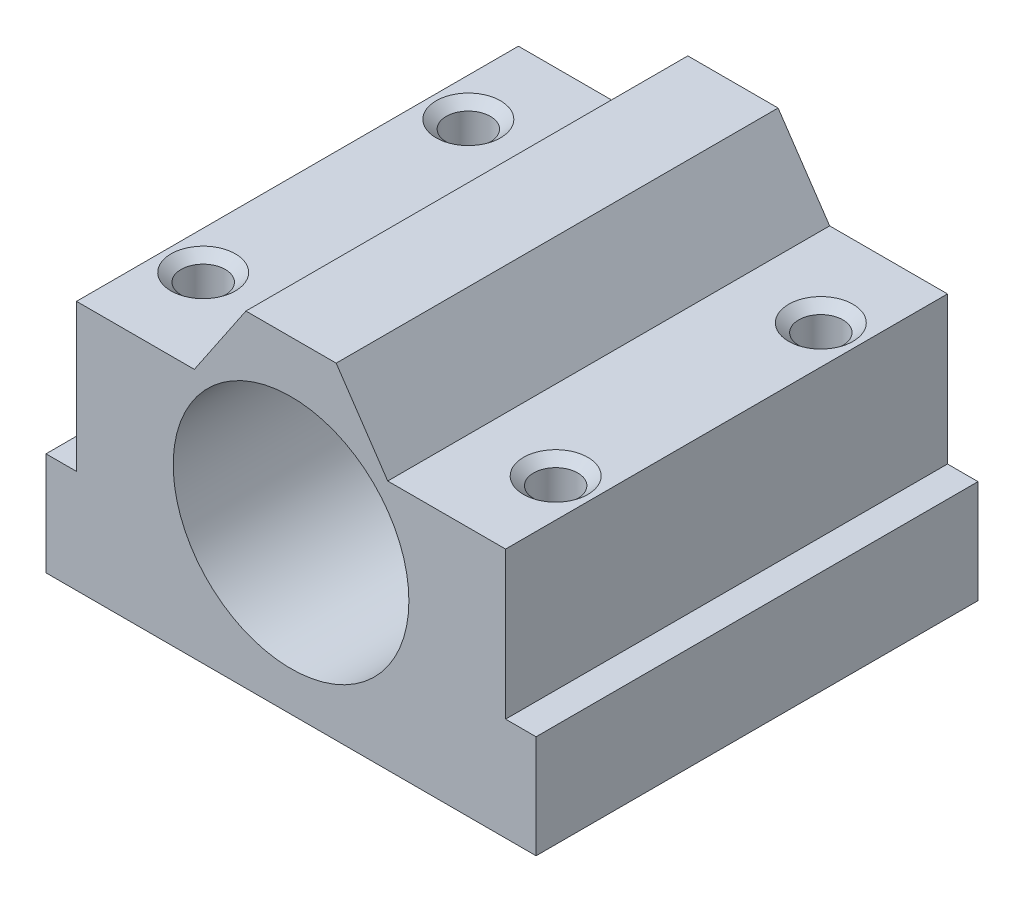
ISO-10303-21;
HEADER;
FILE_DESCRIPTION(('STEP AP214'),'2;1');
FILE_NAME('part.step','',(''),(''),'','','');
FILE_SCHEMA(('AUTOMOTIVE_DESIGN { 1 0 10303 214 1 1 1 1 }'));
ENDSEC;
DATA;
#1=APPLICATION_CONTEXT('core data for automotive mechanical design processes');
#2=APPLICATION_PROTOCOL_DEFINITION('international standard','automotive_design',2000,#1);
#3=PRODUCT_CONTEXT('',#1,'mechanical');
#4=PRODUCT('Part','Part','',(#3));
#5=PRODUCT_RELATED_PRODUCT_CATEGORY('part','',(#4));
#6=PRODUCT_DEFINITION_FORMATION('','',#4);
#7=PRODUCT_DEFINITION_CONTEXT('part definition',#1,'design');
#8=PRODUCT_DEFINITION('design','',#6,#7);
#9=PRODUCT_DEFINITION_SHAPE('','',#8);
#10=(LENGTH_UNIT() NAMED_UNIT(*) SI_UNIT(.MILLI.,.METRE.));
#11=(NAMED_UNIT(*) PLANE_ANGLE_UNIT() SI_UNIT($,.RADIAN.));
#12=(NAMED_UNIT(*) SI_UNIT($,.STERADIAN.) SOLID_ANGLE_UNIT());
#13=UNCERTAINTY_MEASURE_WITH_UNIT(LENGTH_MEASURE(1.E-05),#10,'distance_accuracy_value','');
#14=(GEOMETRIC_REPRESENTATION_CONTEXT(3) GLOBAL_UNCERTAINTY_ASSIGNED_CONTEXT((#13)) GLOBAL_UNIT_ASSIGNED_CONTEXT((#10,
#11,#12)) REPRESENTATION_CONTEXT('',''));
#15=CARTESIAN_POINT('',(0.,0.,0.));
#16=DIRECTION('',(0.,0.,1.));
#17=DIRECTION('',(1.,0.,0.));
#18=AXIS2_PLACEMENT_3D('',#15,#16,#17);
#19=CARTESIAN_POINT('',(0.,0.,30.));
#20=DIRECTION('',(0.,0.,1.));
#21=DIRECTION('',(1.,0.,0.));
#22=AXIS2_PLACEMENT_3D('',#19,#20,#21);
#23=PLANE('',#22);
#24=DIRECTION('',(1.,0.,0.));
#25=VECTOR('',#24,1.);
#26=CARTESIAN_POINT('',(0.,0.,30.));
#27=LINE('',#26,#25);
#28=CARTESIAN_POINT('',(0.,0.,30.));
#29=VERTEX_POINT('',#28);
#30=CARTESIAN_POINT('',(33.27,0.,30.));
#31=VERTEX_POINT('',#30);
#32=EDGE_CURVE('E187',#29,#31,#27,.T.);
#33=ORIENTED_EDGE('',*,*,#32,.T.);
#34=DIRECTION('',(0.,1.,0.));
#35=VECTOR('',#34,1.);
#36=CARTESIAN_POINT('',(33.27,0.,30.));
#37=LINE('',#36,#35);
#38=CARTESIAN_POINT('',(33.27,7.,30.));
#39=VERTEX_POINT('',#38);
#40=EDGE_CURVE('E115',#31,#39,#37,.T.);
#41=ORIENTED_EDGE('',*,*,#40,.T.);
#42=DIRECTION('',(-1.,0.,0.));
#43=VECTOR('',#42,1.);
#44=CARTESIAN_POINT('',(33.27,7.,30.));
#45=LINE('',#44,#43);
#46=CARTESIAN_POINT('',(31.1993641202158,7.,30.));
#47=VERTEX_POINT('',#46);
#48=EDGE_CURVE('E254',#39,#47,#45,.T.);
#49=ORIENTED_EDGE('',*,*,#48,.T.);
#50=DIRECTION('',(0.,1.,0.));
#51=VECTOR('',#50,1.);
#52=CARTESIAN_POINT('',(31.1993641202158,7.,30.));
#53=LINE('',#52,#51);
#54=CARTESIAN_POINT('',(31.1993641202158,17.,30.));
#55=VERTEX_POINT('',#54);
#56=EDGE_CURVE('E256',#47,#55,#53,.T.);
#57=ORIENTED_EDGE('',*,*,#56,.T.);
#58=DIRECTION('',(-1.,0.,0.));
#59=VECTOR('',#58,1.);
#60=CARTESIAN_POINT('',(31.1993641202158,17.,30.));
#61=LINE('',#60,#59);
#62=CARTESIAN_POINT('',(23.1993641202158,17.,30.));
#63=VERTEX_POINT('',#62);
#64=EDGE_CURVE('E258',#55,#63,#61,.T.);
#65=ORIENTED_EDGE('',*,*,#64,.T.);
#66=DIRECTION('',(-0.559857411277987,0.82858896869142,0.));
#67=VECTOR('',#66,1.);
#68=CARTESIAN_POINT('',(23.1993641202158,17.,30.));
#69=LINE('',#68,#67);
#70=CARTESIAN_POINT('',(19.6993641202158,22.18,30.));
#71=VERTEX_POINT('',#70);
#72=EDGE_CURVE('E260',#63,#71,#69,.T.);
#73=ORIENTED_EDGE('',*,*,#72,.T.);
#74=DIRECTION('',(-1.,0.,0.));
#75=VECTOR('',#74,1.);
#76=CARTESIAN_POINT('',(13.5706358797842,22.18,30.));
#77=LINE('',#76,#75);
#78=CARTESIAN_POINT('',(13.5706358797842,22.18,30.));
#79=VERTEX_POINT('',#78);
#80=EDGE_CURVE('E262',#71,#79,#77,.T.);
#81=ORIENTED_EDGE('',*,*,#80,.T.);
#82=DIRECTION('',(-0.559857411277987,-0.82858896869142,0.));
#83=VECTOR('',#82,1.);
#84=CARTESIAN_POINT('',(10.0706358797842,17.,30.));
#85=LINE('',#84,#83);
#86=CARTESIAN_POINT('',(10.0706358797842,17.,30.));
#87=VERTEX_POINT('',#86);
#88=EDGE_CURVE('E264',#79,#87,#85,.T.);
#89=ORIENTED_EDGE('',*,*,#88,.T.);
#90=DIRECTION('',(-1.,0.,0.));
#91=VECTOR('',#90,1.);
#92=CARTESIAN_POINT('',(2.0706358797842,17.,30.));
#93=LINE('',#92,#91);
#94=CARTESIAN_POINT('',(2.0706358797842,17.,30.));
#95=VERTEX_POINT('',#94);
#96=EDGE_CURVE('E146',#87,#95,#93,.T.);
#97=ORIENTED_EDGE('',*,*,#96,.T.);
#98=DIRECTION('',(0.,-1.,0.));
#99=VECTOR('',#98,1.);
#100=CARTESIAN_POINT('',(2.0706358797842,7.,30.));
#101=LINE('',#100,#99);
#102=CARTESIAN_POINT('',(2.0706358797842,7.,30.));
#103=VERTEX_POINT('',#102);
#104=EDGE_CURVE('E140',#95,#103,#101,.T.);
#105=ORIENTED_EDGE('',*,*,#104,.T.);
#106=DIRECTION('',(-1.,0.,0.));
#107=VECTOR('',#106,1.);
#108=CARTESIAN_POINT('',(0.,7.,30.));
#109=LINE('',#108,#107);
#110=CARTESIAN_POINT('',(0.,7.,30.));
#111=VERTEX_POINT('',#110);
#112=EDGE_CURVE('E144',#103,#111,#109,.T.);
#113=ORIENTED_EDGE('',*,*,#112,.T.);
#114=DIRECTION('',(0.,-1.,0.));
#115=VECTOR('',#114,1.);
#116=CARTESIAN_POINT('',(0.,0.,30.));
#117=LINE('',#116,#115);
#118=EDGE_CURVE('E60',#111,#29,#117,.T.);
#119=ORIENTED_EDGE('',*,*,#118,.T.);
#120=EDGE_LOOP('',(#33,#41,#49,#57,#65,#73,#81,#89,#97,#105,#113,#119));
#121=FACE_BOUND('',#120,.T.);
#122=CARTESIAN_POINT('',(16.635,10.68,30.));
#123=DIRECTION('',(0.,0.,1.));
#124=DIRECTION('',(1.,0.,0.));
#125=AXIS2_PLACEMENT_3D('',#122,#123,#124);
#126=CIRCLE('',#125,8.);
#127=CARTESIAN_POINT('',(24.635,10.68,30.));
#128=VERTEX_POINT('',#127);
#129=EDGE_CURVE('E168',#128,#128,#126,.T.);
#130=ORIENTED_EDGE('',*,*,#129,.F.);
#131=EDGE_LOOP('',(#130));
#132=FACE_BOUND('',#131,.T.);
#133=ADVANCED_FACE('F41',(#121,#132),#23,.T.);
#134=CARTESIAN_POINT('',(0.,0.,0.));
#135=DIRECTION('',(0.,0.,1.));
#136=DIRECTION('',(1.,0.,0.));
#137=AXIS2_PLACEMENT_3D('',#134,#135,#136);
#138=PLANE('',#137);
#139=DIRECTION('',(1.,0.,0.));
#140=VECTOR('',#139,1.);
#141=CARTESIAN_POINT('',(0.,0.,0.));
#142=LINE('',#141,#140);
#143=CARTESIAN_POINT('',(0.,0.,0.));
#144=VERTEX_POINT('',#143);
#145=CARTESIAN_POINT('',(33.27,0.,0.));
#146=VERTEX_POINT('',#145);
#147=EDGE_CURVE('E164',#144,#146,#142,.T.);
#148=ORIENTED_EDGE('',*,*,#147,.F.);
#149=DIRECTION('',(0.,-1.,0.));
#150=VECTOR('',#149,1.);
#151=CARTESIAN_POINT('',(0.,0.,0.));
#152=LINE('',#151,#150);
#153=CARTESIAN_POINT('',(0.,7.,0.));
#154=VERTEX_POINT('',#153);
#155=EDGE_CURVE('E107',#154,#144,#152,.T.);
#156=ORIENTED_EDGE('',*,*,#155,.F.);
#157=DIRECTION('',(-1.,0.,0.));
#158=VECTOR('',#157,1.);
#159=CARTESIAN_POINT('',(0.,7.,0.));
#160=LINE('',#159,#158);
#161=CARTESIAN_POINT('',(2.0706358797842,7.,0.));
#162=VERTEX_POINT('',#161);
#163=EDGE_CURVE('E101',#162,#154,#160,.T.);
#164=ORIENTED_EDGE('',*,*,#163,.F.);
#165=DIRECTION('',(0.,-1.,0.));
#166=VECTOR('',#165,1.);
#167=CARTESIAN_POINT('',(2.0706358797842,7.,0.));
#168=LINE('',#167,#166);
#169=CARTESIAN_POINT('',(2.0706358797842,17.,0.));
#170=VERTEX_POINT('',#169);
#171=EDGE_CURVE('E154',#170,#162,#168,.T.);
#172=ORIENTED_EDGE('',*,*,#171,.F.);
#173=DIRECTION('',(-1.,0.,0.));
#174=VECTOR('',#173,1.);
#175=CARTESIAN_POINT('',(2.0706358797842,17.,0.));
#176=LINE('',#175,#174);
#177=CARTESIAN_POINT('',(10.0706358797842,17.,0.));
#178=VERTEX_POINT('',#177);
#179=EDGE_CURVE('E182',#178,#170,#176,.T.);
#180=ORIENTED_EDGE('',*,*,#179,.F.);
#181=DIRECTION('',(-0.559857411277987,-0.82858896869142,0.));
#182=VECTOR('',#181,1.);
#183=CARTESIAN_POINT('',(10.0706358797842,17.,0.));
#184=LINE('',#183,#182);
#185=CARTESIAN_POINT('',(13.5706358797842,22.18,0.));
#186=VERTEX_POINT('',#185);
#187=EDGE_CURVE('E180',#186,#178,#184,.T.);
#188=ORIENTED_EDGE('',*,*,#187,.F.);
#189=DIRECTION('',(-1.,0.,0.));
#190=VECTOR('',#189,1.);
#191=CARTESIAN_POINT('',(13.5706358797842,22.18,0.));
#192=LINE('',#191,#190);
#193=CARTESIAN_POINT('',(19.6993641202158,22.18,0.));
#194=VERTEX_POINT('',#193);
#195=EDGE_CURVE('E178',#194,#186,#192,.T.);
#196=ORIENTED_EDGE('',*,*,#195,.F.);
#197=DIRECTION('',(-0.559857411277987,0.82858896869142,0.));
#198=VECTOR('',#197,1.);
#199=CARTESIAN_POINT('',(23.1993641202158,17.,0.));
#200=LINE('',#199,#198);
#201=CARTESIAN_POINT('',(23.1993641202158,17.,0.));
#202=VERTEX_POINT('',#201);
#203=EDGE_CURVE('E176',#202,#194,#200,.T.);
#204=ORIENTED_EDGE('',*,*,#203,.F.);
#205=DIRECTION('',(-1.,0.,0.));
#206=VECTOR('',#205,1.);
#207=CARTESIAN_POINT('',(31.1993641202158,17.,0.));
#208=LINE('',#207,#206);
#209=CARTESIAN_POINT('',(31.1993641202158,17.,0.));
#210=VERTEX_POINT('',#209);
#211=EDGE_CURVE('E174',#210,#202,#208,.T.);
#212=ORIENTED_EDGE('',*,*,#211,.F.);
#213=DIRECTION('',(0.,1.,0.));
#214=VECTOR('',#213,1.);
#215=CARTESIAN_POINT('',(31.1993641202158,7.,0.));
#216=LINE('',#215,#214);
#217=CARTESIAN_POINT('',(31.1993641202158,7.,0.));
#218=VERTEX_POINT('',#217);
#219=EDGE_CURVE('E172',#218,#210,#216,.T.);
#220=ORIENTED_EDGE('',*,*,#219,.F.);
#221=DIRECTION('',(-1.,0.,0.));
#222=VECTOR('',#221,1.);
#223=CARTESIAN_POINT('',(33.27,7.,0.));
#224=LINE('',#223,#222);
#225=CARTESIAN_POINT('',(33.27,7.,0.));
#226=VERTEX_POINT('',#225);
#227=EDGE_CURVE('E170',#226,#218,#224,.T.);
#228=ORIENTED_EDGE('',*,*,#227,.F.);
#229=DIRECTION('',(0.,1.,0.));
#230=VECTOR('',#229,1.);
#231=CARTESIAN_POINT('',(33.27,0.,0.));
#232=LINE('',#231,#230);
#233=EDGE_CURVE('E167',#146,#226,#232,.T.);
#234=ORIENTED_EDGE('',*,*,#233,.F.);
#235=EDGE_LOOP('',(#148,#156,#164,#172,#180,#188,#196,#204,#212,#220,#228,#234));
#236=FACE_BOUND('',#235,.T.);
#237=CARTESIAN_POINT('',(16.635,10.68,0.));
#238=DIRECTION('',(0.,0.,1.));
#239=DIRECTION('',(1.,0.,0.));
#240=AXIS2_PLACEMENT_3D('',#237,#238,#239);
#241=CIRCLE('',#240,8.);
#242=CARTESIAN_POINT('',(24.635,10.68,0.));
#243=VERTEX_POINT('',#242);
#244=EDGE_CURVE('E247',#243,#243,#241,.T.);
#245=ORIENTED_EDGE('',*,*,#244,.T.);
#246=EDGE_LOOP('',(#245));
#247=FACE_BOUND('',#246,.T.);
#248=ADVANCED_FACE('F277',(#236,#247),#138,.F.);
#249=CARTESIAN_POINT('',(0.,0.,30.));
#250=DIRECTION('',(0.,1.,0.));
#251=DIRECTION('',(0.,0.,1.));
#252=AXIS2_PLACEMENT_3D('',#249,#250,#251);
#253=PLANE('',#252);
#254=CARTESIAN_POINT('',(4.67063587978421,0.,6.));
#255=DIRECTION('',(0.,1.,0.));
#256=DIRECTION('',(0.,0.,1.));
#257=AXIS2_PLACEMENT_3D('',#254,#255,#256);
#258=CIRCLE('',#257,1.5);
#259=CARTESIAN_POINT('',(4.67063587978421,0.,7.5));
#260=VERTEX_POINT('',#259);
#261=EDGE_CURVE('E238',#260,#260,#258,.T.);
#262=ORIENTED_EDGE('',*,*,#261,.T.);
#263=EDGE_LOOP('',(#262));
#264=FACE_BOUND('',#263,.T.);
#265=CARTESIAN_POINT('',(4.67063587978422,0.,24.));
#266=DIRECTION('',(0.,1.,0.));
#267=DIRECTION('',(0.,0.,1.));
#268=AXIS2_PLACEMENT_3D('',#265,#266,#267);
#269=CIRCLE('',#268,1.5);
#270=CARTESIAN_POINT('',(4.67063587978422,0.,25.5));
#271=VERTEX_POINT('',#270);
#272=EDGE_CURVE('E214',#271,#271,#269,.T.);
#273=ORIENTED_EDGE('',*,*,#272,.T.);
#274=EDGE_LOOP('',(#273));
#275=FACE_BOUND('',#274,.T.);
#276=CARTESIAN_POINT('',(28.5993641202158,0.,24.));
#277=DIRECTION('',(0.,1.,0.));
#278=DIRECTION('',(0.,0.,1.));
#279=AXIS2_PLACEMENT_3D('',#276,#277,#278);
#280=CIRCLE('',#279,1.5);
#281=CARTESIAN_POINT('',(28.5993641202158,0.,25.5));
#282=VERTEX_POINT('',#281);
#283=EDGE_CURVE('E244',#282,#282,#280,.T.);
#284=ORIENTED_EDGE('',*,*,#283,.T.);
#285=EDGE_LOOP('',(#284));
#286=FACE_BOUND('',#285,.T.);
#287=CARTESIAN_POINT('',(28.5993641202158,0.,6.));
#288=DIRECTION('',(0.,1.,0.));
#289=DIRECTION('',(0.,0.,1.));
#290=AXIS2_PLACEMENT_3D('',#287,#288,#289);
#291=CIRCLE('',#290,1.5);
#292=CARTESIAN_POINT('',(28.5993641202158,0.,7.5));
#293=VERTEX_POINT('',#292);
#294=EDGE_CURVE('E241',#293,#293,#291,.T.);
#295=ORIENTED_EDGE('',*,*,#294,.T.);
#296=EDGE_LOOP('',(#295));
#297=FACE_BOUND('',#296,.T.);
#298=ORIENTED_EDGE('',*,*,#147,.T.);
#299=DIRECTION('',(0.,0.,-1.));
#300=VECTOR('',#299,1.);
#301=CARTESIAN_POINT('',(33.27,0.,30.));
#302=LINE('',#301,#300);
#303=EDGE_CURVE('E11',#31,#146,#302,.T.);
#304=ORIENTED_EDGE('',*,*,#303,.F.);
#305=ORIENTED_EDGE('',*,*,#32,.F.);
#306=DIRECTION('',(0.,0.,-1.));
#307=VECTOR('',#306,1.);
#308=CARTESIAN_POINT('',(0.,0.,30.));
#309=LINE('',#308,#307);
#310=EDGE_CURVE('E160',#29,#144,#309,.T.);
#311=ORIENTED_EDGE('',*,*,#310,.T.);
#312=EDGE_LOOP('',(#298,#304,#305,#311));
#313=FACE_BOUND('',#312,.T.);
#314=ADVANCED_FACE('F43',(#264,#275,#286,#297,#313),#253,.F.);
#315=CARTESIAN_POINT('',(33.27,0.,30.));
#316=DIRECTION('',(-1.,0.,0.));
#317=DIRECTION('',(0.,0.,1.));
#318=AXIS2_PLACEMENT_3D('',#315,#316,#317);
#319=PLANE('',#318);
#320=ORIENTED_EDGE('',*,*,#233,.T.);
#321=DIRECTION('',(0.,0.,-1.));
#322=VECTOR('',#321,1.);
#323=CARTESIAN_POINT('',(33.27,7.,30.));
#324=LINE('',#323,#322);
#325=EDGE_CURVE('E51',#39,#226,#324,.T.);
#326=ORIENTED_EDGE('',*,*,#325,.F.);
#327=ORIENTED_EDGE('',*,*,#40,.F.);
#328=ORIENTED_EDGE('',*,*,#303,.T.);
#329=EDGE_LOOP('',(#320,#326,#327,#328));
#330=FACE_BOUND('',#329,.T.);
#331=ADVANCED_FACE('F341',(#330),#319,.F.);
#332=CARTESIAN_POINT('',(33.27,7.,30.));
#333=DIRECTION('',(0.,-1.,0.));
#334=DIRECTION('',(0.,0.,-1.));
#335=AXIS2_PLACEMENT_3D('',#332,#333,#334);
#336=PLANE('',#335);
#337=ORIENTED_EDGE('',*,*,#227,.T.);
#338=DIRECTION('',(0.,0.,-1.));
#339=VECTOR('',#338,1.);
#340=CARTESIAN_POINT('',(31.1993641202158,7.,30.));
#341=LINE('',#340,#339);
#342=EDGE_CURVE('E206',#47,#218,#341,.T.);
#343=ORIENTED_EDGE('',*,*,#342,.F.);
#344=ORIENTED_EDGE('',*,*,#48,.F.);
#345=ORIENTED_EDGE('',*,*,#325,.T.);
#346=EDGE_LOOP('',(#337,#343,#344,#345));
#347=FACE_BOUND('',#346,.T.);
#348=ADVANCED_FACE('F348',(#347),#336,.F.);
#349=CARTESIAN_POINT('',(31.1993641202158,7.,30.));
#350=DIRECTION('',(-1.,0.,0.));
#351=DIRECTION('',(0.,0.,1.));
#352=AXIS2_PLACEMENT_3D('',#349,#350,#351);
#353=PLANE('',#352);
#354=ORIENTED_EDGE('',*,*,#219,.T.);
#355=DIRECTION('',(0.,0.,-1.));
#356=VECTOR('',#355,1.);
#357=CARTESIAN_POINT('',(31.1993641202158,17.,30.));
#358=LINE('',#357,#356);
#359=EDGE_CURVE('E203',#55,#210,#358,.T.);
#360=ORIENTED_EDGE('',*,*,#359,.F.);
#361=ORIENTED_EDGE('',*,*,#56,.F.);
#362=ORIENTED_EDGE('',*,*,#342,.T.);
#363=EDGE_LOOP('',(#354,#360,#361,#362));
#364=FACE_BOUND('',#363,.T.);
#365=ADVANCED_FACE('F357',(#364),#353,.F.);
#366=CARTESIAN_POINT('',(31.1993641202158,17.,30.));
#367=DIRECTION('',(0.,-1.,0.));
#368=DIRECTION('',(0.,0.,-1.));
#369=AXIS2_PLACEMENT_3D('',#366,#367,#368);
#370=PLANE('',#369);
#371=CARTESIAN_POINT('',(28.5993641202158,17.,24.));
#372=DIRECTION('',(0.,1.,0.));
#373=DIRECTION('',(0.,0.,1.));
#374=AXIS2_PLACEMENT_3D('',#371,#372,#373);
#375=CIRCLE('',#374,2.1844);
#376=CARTESIAN_POINT('',(28.5993641202158,17.,26.1844));
#377=VERTEX_POINT('',#376);
#378=EDGE_CURVE('E231',#377,#377,#375,.T.);
#379=ORIENTED_EDGE('',*,*,#378,.F.);
#380=EDGE_LOOP('',(#379));
#381=FACE_BOUND('',#380,.T.);
#382=CARTESIAN_POINT('',(28.5993641202158,17.,6.));
#383=DIRECTION('',(0.,1.,0.));
#384=DIRECTION('',(0.,0.,1.));
#385=AXIS2_PLACEMENT_3D('',#382,#383,#384);
#386=CIRCLE('',#385,2.1844);
#387=CARTESIAN_POINT('',(28.5993641202158,17.,8.1844));
#388=VERTEX_POINT('',#387);
#389=EDGE_CURVE('E221',#388,#388,#386,.T.);
#390=ORIENTED_EDGE('',*,*,#389,.F.);
#391=EDGE_LOOP('',(#390));
#392=FACE_BOUND('',#391,.T.);
#393=ORIENTED_EDGE('',*,*,#211,.T.);
#394=DIRECTION('',(0.,0.,-1.));
#395=VECTOR('',#394,1.);
#396=CARTESIAN_POINT('',(23.1993641202158,17.,30.));
#397=LINE('',#396,#395);
#398=EDGE_CURVE('E200',#63,#202,#397,.T.);
#399=ORIENTED_EDGE('',*,*,#398,.F.);
#400=ORIENTED_EDGE('',*,*,#64,.F.);
#401=ORIENTED_EDGE('',*,*,#359,.T.);
#402=EDGE_LOOP('',(#393,#399,#400,#401));
#403=FACE_BOUND('',#402,.T.);
#404=ADVANCED_FACE('F363',(#381,#392,#403),#370,.F.);
#405=CARTESIAN_POINT('',(23.1993641202158,17.,30.));
#406=DIRECTION('',(-0.82858896869142,-0.559857411277987,0.));
#407=DIRECTION('',(0.559857411277987,-0.82858896869142,0.));
#408=AXIS2_PLACEMENT_3D('',#405,#406,#407);
#409=PLANE('',#408);
#410=ORIENTED_EDGE('',*,*,#203,.T.);
#411=DIRECTION('',(0.,0.,-1.));
#412=VECTOR('',#411,1.);
#413=CARTESIAN_POINT('',(19.6993641202158,22.18,30.));
#414=LINE('',#413,#412);
#415=EDGE_CURVE('E197',#71,#194,#414,.T.);
#416=ORIENTED_EDGE('',*,*,#415,.F.);
#417=ORIENTED_EDGE('',*,*,#72,.F.);
#418=ORIENTED_EDGE('',*,*,#398,.T.);
#419=EDGE_LOOP('',(#410,#416,#417,#418));
#420=FACE_BOUND('',#419,.T.);
#421=ADVANCED_FACE('F367',(#420),#409,.F.);
#422=CARTESIAN_POINT('',(13.5706358797842,22.18,30.));
#423=DIRECTION('',(0.,-1.,0.));
#424=DIRECTION('',(0.,0.,-1.));
#425=AXIS2_PLACEMENT_3D('',#422,#423,#424);
#426=PLANE('',#425);
#427=ORIENTED_EDGE('',*,*,#195,.T.);
#428=DIRECTION('',(0.,0.,-1.));
#429=VECTOR('',#428,1.);
#430=CARTESIAN_POINT('',(13.5706358797842,22.18,30.));
#431=LINE('',#430,#429);
#432=EDGE_CURVE('E194',#79,#186,#431,.T.);
#433=ORIENTED_EDGE('',*,*,#432,.F.);
#434=ORIENTED_EDGE('',*,*,#80,.F.);
#435=ORIENTED_EDGE('',*,*,#415,.T.);
#436=EDGE_LOOP('',(#427,#433,#434,#435));
#437=FACE_BOUND('',#436,.T.);
#438=ADVANCED_FACE('F371',(#437),#426,.F.);
#439=CARTESIAN_POINT('',(10.0706358797842,17.,30.));
#440=DIRECTION('',(0.82858896869142,-0.559857411277987,0.));
#441=DIRECTION('',(0.559857411277987,0.82858896869142,0.));
#442=AXIS2_PLACEMENT_3D('',#439,#440,#441);
#443=PLANE('',#442);
#444=ORIENTED_EDGE('',*,*,#187,.T.);
#445=DIRECTION('',(0.,0.,-1.));
#446=VECTOR('',#445,1.);
#447=CARTESIAN_POINT('',(10.0706358797842,17.,30.));
#448=LINE('',#447,#446);
#449=EDGE_CURVE('E191',#87,#178,#448,.T.);
#450=ORIENTED_EDGE('',*,*,#449,.F.);
#451=ORIENTED_EDGE('',*,*,#88,.F.);
#452=ORIENTED_EDGE('',*,*,#432,.T.);
#453=EDGE_LOOP('',(#444,#450,#451,#452));
#454=FACE_BOUND('',#453,.T.);
#455=ADVANCED_FACE('F270',(#454),#443,.F.);
#456=CARTESIAN_POINT('',(2.0706358797842,17.,30.));
#457=DIRECTION('',(0.,-1.,0.));
#458=DIRECTION('',(0.,0.,-1.));
#459=AXIS2_PLACEMENT_3D('',#456,#457,#458);
#460=PLANE('',#459);
#461=CARTESIAN_POINT('',(4.67063587978422,17.,24.));
#462=DIRECTION('',(0.,1.,0.));
#463=DIRECTION('',(0.,0.,1.));
#464=AXIS2_PLACEMENT_3D('',#461,#462,#463);
#465=CIRCLE('',#464,2.1844);
#466=CARTESIAN_POINT('',(4.67063587978422,17.,26.1844));
#467=VERTEX_POINT('',#466);
#468=EDGE_CURVE('E218',#467,#467,#465,.T.);
#469=ORIENTED_EDGE('',*,*,#468,.F.);
#470=EDGE_LOOP('',(#469));
#471=FACE_BOUND('',#470,.T.);
#472=CARTESIAN_POINT('',(4.67063587978421,17.,6.));
#473=DIRECTION('',(0.,1.,0.));
#474=DIRECTION('',(0.,0.,1.));
#475=AXIS2_PLACEMENT_3D('',#472,#473,#474);
#476=CIRCLE('',#475,2.1844);
#477=CARTESIAN_POINT('',(4.67063587978421,17.,8.1844));
#478=VERTEX_POINT('',#477);
#479=EDGE_CURVE('E215',#478,#478,#476,.T.);
#480=ORIENTED_EDGE('',*,*,#479,.F.);
#481=EDGE_LOOP('',(#480));
#482=FACE_BOUND('',#481,.T.);
#483=ORIENTED_EDGE('',*,*,#179,.T.);
#484=DIRECTION('',(0.,0.,-1.));
#485=VECTOR('',#484,1.);
#486=CARTESIAN_POINT('',(2.0706358797842,17.,30.));
#487=LINE('',#486,#485);
#488=EDGE_CURVE('E155',#95,#170,#487,.T.);
#489=ORIENTED_EDGE('',*,*,#488,.F.);
#490=ORIENTED_EDGE('',*,*,#96,.F.);
#491=ORIENTED_EDGE('',*,*,#449,.T.);
#492=EDGE_LOOP('',(#483,#489,#490,#491));
#493=FACE_BOUND('',#492,.T.);
#494=ADVANCED_FACE('F274',(#471,#482,#493),#460,.F.);
#495=CARTESIAN_POINT('',(2.0706358797842,7.,30.));
#496=DIRECTION('',(1.,0.,0.));
#497=DIRECTION('',(0.,0.,-1.));
#498=AXIS2_PLACEMENT_3D('',#495,#496,#497);
#499=PLANE('',#498);
#500=ORIENTED_EDGE('',*,*,#171,.T.);
#501=DIRECTION('',(0.,0.,-1.));
#502=VECTOR('',#501,1.);
#503=CARTESIAN_POINT('',(2.0706358797842,7.,30.));
#504=LINE('',#503,#502);
#505=EDGE_CURVE('E151',#103,#162,#504,.T.);
#506=ORIENTED_EDGE('',*,*,#505,.F.);
#507=ORIENTED_EDGE('',*,*,#104,.F.);
#508=ORIENTED_EDGE('',*,*,#488,.T.);
#509=EDGE_LOOP('',(#500,#506,#507,#508));
#510=FACE_BOUND('',#509,.T.);
#511=ADVANCED_FACE('F152',(#510),#499,.F.);
#512=CARTESIAN_POINT('',(0.,7.,30.));
#513=DIRECTION('',(0.,-1.,0.));
#514=DIRECTION('',(0.,0.,-1.));
#515=AXIS2_PLACEMENT_3D('',#512,#513,#514);
#516=PLANE('',#515);
#517=ORIENTED_EDGE('',*,*,#163,.T.);
#518=DIRECTION('',(0.,0.,-1.));
#519=VECTOR('',#518,1.);
#520=CARTESIAN_POINT('',(0.,7.,30.));
#521=LINE('',#520,#519);
#522=EDGE_CURVE('E156',#111,#154,#521,.T.);
#523=ORIENTED_EDGE('',*,*,#522,.F.);
#524=ORIENTED_EDGE('',*,*,#112,.F.);
#525=ORIENTED_EDGE('',*,*,#505,.T.);
#526=EDGE_LOOP('',(#517,#523,#524,#525));
#527=FACE_BOUND('',#526,.T.);
#528=ADVANCED_FACE('F158',(#527),#516,.F.);
#529=CARTESIAN_POINT('',(0.,0.,30.));
#530=DIRECTION('',(1.,0.,0.));
#531=DIRECTION('',(0.,0.,-1.));
#532=AXIS2_PLACEMENT_3D('',#529,#530,#531);
#533=PLANE('',#532);
#534=ORIENTED_EDGE('',*,*,#155,.T.);
#535=ORIENTED_EDGE('',*,*,#310,.F.);
#536=ORIENTED_EDGE('',*,*,#118,.F.);
#537=ORIENTED_EDGE('',*,*,#522,.T.);
#538=EDGE_LOOP('',(#534,#535,#536,#537));
#539=FACE_BOUND('',#538,.T.);
#540=ADVANCED_FACE('F283',(#539),#533,.F.);
#541=CARTESIAN_POINT('',(16.635,10.68,30.));
#542=DIRECTION('',(0.,0.,-1.));
#543=DIRECTION('',(-1.,0.,0.));
#544=AXIS2_PLACEMENT_3D('',#541,#542,#543);
#545=CYLINDRICAL_SURFACE('',#544,8.);
#546=ORIENTED_EDGE('',*,*,#129,.T.);
#547=EDGE_LOOP('',(#546));
#548=FACE_BOUND('',#547,.T.);
#549=ORIENTED_EDGE('',*,*,#244,.F.);
#550=EDGE_LOOP('',(#549));
#551=FACE_BOUND('',#550,.T.);
#552=ADVANCED_FACE('F285',(#548,#551),#545,.F.);
#553=CARTESIAN_POINT('',(4.67063587978422,-13.,24.));
#554=DIRECTION('',(0.,1.,0.));
#555=DIRECTION('',(0.,0.,1.));
#556=AXIS2_PLACEMENT_3D('',#553,#554,#555);
#557=CYLINDRICAL_SURFACE('',#556,1.5);
#558=CARTESIAN_POINT('',(4.67063587978422,16.4257202124223,24.));
#559=DIRECTION('',(0.,1.,0.));
#560=DIRECTION('',(0.,0.,1.));
#561=AXIS2_PLACEMENT_3D('',#558,#559,#560);
#562=CIRCLE('',#561,1.5);
#563=CARTESIAN_POINT('',(4.67063587978422,16.4257202124223,25.5));
#564=VERTEX_POINT('',#563);
#565=EDGE_CURVE('E216',#564,#564,#562,.T.);
#566=ORIENTED_EDGE('',*,*,#565,.T.);
#567=EDGE_LOOP('',(#566));
#568=FACE_BOUND('',#567,.T.);
#569=ORIENTED_EDGE('',*,*,#272,.F.);
#570=EDGE_LOOP('',(#569));
#571=FACE_BOUND('',#570,.T.);
#572=ADVANCED_FACE('F291',(#568,#571),#557,.F.);
#573=CARTESIAN_POINT('',(4.67063587978421,-13.,6.));
#574=DIRECTION('',(0.,1.,0.));
#575=DIRECTION('',(0.,0.,1.));
#576=AXIS2_PLACEMENT_3D('',#573,#574,#575);
#577=CYLINDRICAL_SURFACE('',#576,1.5);
#578=CARTESIAN_POINT('',(4.67063587978421,16.4257202124223,6.));
#579=DIRECTION('',(0.,1.,0.));
#580=DIRECTION('',(0.,0.,1.));
#581=AXIS2_PLACEMENT_3D('',#578,#579,#580);
#582=CIRCLE('',#581,1.5);
#583=CARTESIAN_POINT('',(4.67063587978421,16.4257202124223,7.5));
#584=VERTEX_POINT('',#583);
#585=EDGE_CURVE('E211',#584,#584,#582,.T.);
#586=ORIENTED_EDGE('',*,*,#585,.T.);
#587=EDGE_LOOP('',(#586));
#588=FACE_BOUND('',#587,.T.);
#589=ORIENTED_EDGE('',*,*,#261,.F.);
#590=EDGE_LOOP('',(#589));
#591=FACE_BOUND('',#590,.T.);
#592=ADVANCED_FACE('F306',(#588,#591),#577,.F.);
#593=CARTESIAN_POINT('',(28.5993641202158,-13.,6.));
#594=DIRECTION('',(0.,1.,0.));
#595=DIRECTION('',(0.,0.,1.));
#596=AXIS2_PLACEMENT_3D('',#593,#594,#595);
#597=CYLINDRICAL_SURFACE('',#596,1.5);
#598=CARTESIAN_POINT('',(28.5993641202158,16.4257202124223,6.));
#599=DIRECTION('',(0.,1.,0.));
#600=DIRECTION('',(0.,0.,1.));
#601=AXIS2_PLACEMENT_3D('',#598,#599,#600);
#602=CIRCLE('',#601,1.5);
#603=CARTESIAN_POINT('',(28.5993641202158,16.4257202124223,7.5));
#604=VERTEX_POINT('',#603);
#605=EDGE_CURVE('E219',#604,#604,#602,.T.);
#606=ORIENTED_EDGE('',*,*,#605,.T.);
#607=EDGE_LOOP('',(#606));
#608=FACE_BOUND('',#607,.T.);
#609=ORIENTED_EDGE('',*,*,#294,.F.);
#610=EDGE_LOOP('',(#609));
#611=FACE_BOUND('',#610,.T.);
#612=ADVANCED_FACE('F302',(#608,#611),#597,.F.);
#613=CARTESIAN_POINT('',(28.5993641202158,-13.,24.));
#614=DIRECTION('',(0.,1.,0.));
#615=DIRECTION('',(0.,0.,1.));
#616=AXIS2_PLACEMENT_3D('',#613,#614,#615);
#617=CYLINDRICAL_SURFACE('',#616,1.5);
#618=CARTESIAN_POINT('',(28.5993641202158,16.4257202124223,24.));
#619=DIRECTION('',(0.,1.,0.));
#620=DIRECTION('',(0.,0.,1.));
#621=AXIS2_PLACEMENT_3D('',#618,#619,#620);
#622=CIRCLE('',#621,1.5);
#623=CARTESIAN_POINT('',(28.5993641202158,16.4257202124223,25.5));
#624=VERTEX_POINT('',#623);
#625=EDGE_CURVE('E45',#624,#624,#622,.T.);
#626=ORIENTED_EDGE('',*,*,#625,.T.);
#627=EDGE_LOOP('',(#626));
#628=FACE_BOUND('',#627,.T.);
#629=ORIENTED_EDGE('',*,*,#283,.F.);
#630=EDGE_LOOP('',(#629));
#631=FACE_BOUND('',#630,.T.);
#632=ADVANCED_FACE('F305',(#628,#631),#617,.F.);
#633=CARTESIAN_POINT('',(4.67063587978421,17.,6.));
#634=DIRECTION('',(0.,1.,0.));
#635=DIRECTION('',(0.,0.,1.));
#636=AXIS2_PLACEMENT_3D('',#633,#634,#635);
#637=CONICAL_SURFACE('',#636,2.1844,0.872664625997164);
#638=ORIENTED_EDGE('',*,*,#479,.T.);
#639=EDGE_LOOP('',(#638));
#640=FACE_BOUND('',#639,.T.);
#641=ORIENTED_EDGE('',*,*,#585,.F.);
#642=EDGE_LOOP('',(#641));
#643=FACE_BOUND('',#642,.T.);
#644=ADVANCED_FACE('F315',(#640,#643),#637,.F.);
#645=CARTESIAN_POINT('',(4.67063587978422,17.,24.));
#646=DIRECTION('',(0.,1.,0.));
#647=DIRECTION('',(0.,0.,1.));
#648=AXIS2_PLACEMENT_3D('',#645,#646,#647);
#649=CONICAL_SURFACE('',#648,2.1844,0.872664625997178);
#650=ORIENTED_EDGE('',*,*,#468,.T.);
#651=EDGE_LOOP('',(#650));
#652=FACE_BOUND('',#651,.T.);
#653=ORIENTED_EDGE('',*,*,#565,.F.);
#654=EDGE_LOOP('',(#653));
#655=FACE_BOUND('',#654,.T.);
#656=ADVANCED_FACE('F319',(#652,#655),#649,.F.);
#657=CARTESIAN_POINT('',(28.5993641202158,17.,6.));
#658=DIRECTION('',(0.,1.,0.));
#659=DIRECTION('',(0.,0.,1.));
#660=AXIS2_PLACEMENT_3D('',#657,#658,#659);
#661=CONICAL_SURFACE('',#660,2.1844,0.872664625997178);
#662=ORIENTED_EDGE('',*,*,#389,.T.);
#663=EDGE_LOOP('',(#662));
#664=FACE_BOUND('',#663,.T.);
#665=ORIENTED_EDGE('',*,*,#605,.F.);
#666=EDGE_LOOP('',(#665));
#667=FACE_BOUND('',#666,.T.);
#668=ADVANCED_FACE('F323',(#664,#667),#661,.F.);
#669=CARTESIAN_POINT('',(28.5993641202158,17.,24.));
#670=DIRECTION('',(0.,1.,0.));
#671=DIRECTION('',(0.,0.,1.));
#672=AXIS2_PLACEMENT_3D('',#669,#670,#671);
#673=CONICAL_SURFACE('',#672,2.1844,0.872664625997178);
#674=ORIENTED_EDGE('',*,*,#378,.T.);
#675=EDGE_LOOP('',(#674));
#676=FACE_BOUND('',#675,.T.);
#677=ORIENTED_EDGE('',*,*,#625,.F.);
#678=EDGE_LOOP('',(#677));
#679=FACE_BOUND('',#678,.T.);
#680=ADVANCED_FACE('F327',(#676,#679),#673,.F.);
#681=CLOSED_SHELL('',(#133,#248,#314,#331,#348,#365,#404,#421,#438,#455,#494,#511,#528,#540,
#552,#572,#592,#612,#632,#644,#656,#668,#680));
#682=MANIFOLD_SOLID_BREP('B2',#681);
#683=ADVANCED_BREP_SHAPE_REPRESENTATION('',(#18,#682),#14);
#684=SHAPE_DEFINITION_REPRESENTATION(#9,#683);
ENDSEC;
END-ISO-10303-21;
